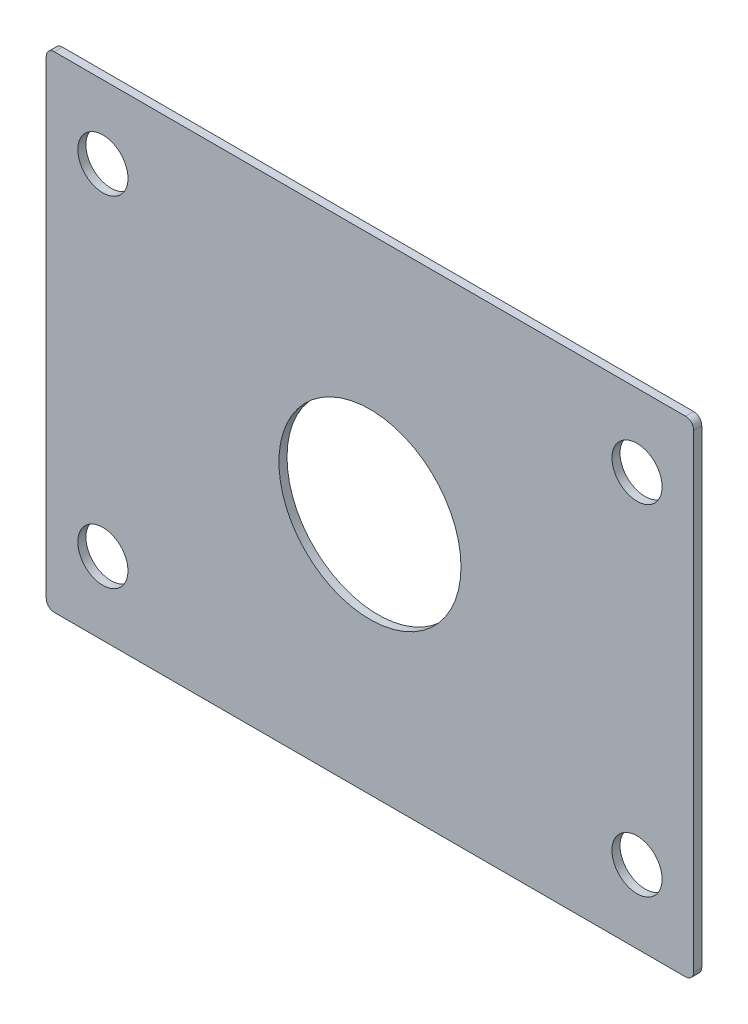
ISO-10303-21;
HEADER;
FILE_DESCRIPTION(('STEP AP214'),'2;1');
FILE_NAME('part.step','',(''),(''),'','','');
FILE_SCHEMA(('AUTOMOTIVE_DESIGN { 1 0 10303 214 1 1 1 1 }'));
ENDSEC;
DATA;
#1=APPLICATION_CONTEXT('core data for automotive mechanical design processes');
#2=APPLICATION_PROTOCOL_DEFINITION('international standard','automotive_design',2000,#1);
#3=PRODUCT_CONTEXT('',#1,'mechanical');
#4=PRODUCT('Part','Part','',(#3));
#5=PRODUCT_RELATED_PRODUCT_CATEGORY('part','',(#4));
#6=PRODUCT_DEFINITION_FORMATION('','',#4);
#7=PRODUCT_DEFINITION_CONTEXT('part definition',#1,'design');
#8=PRODUCT_DEFINITION('design','',#6,#7);
#9=PRODUCT_DEFINITION_SHAPE('','',#8);
#10=(LENGTH_UNIT() NAMED_UNIT(*) SI_UNIT(.MILLI.,.METRE.));
#11=(NAMED_UNIT(*) PLANE_ANGLE_UNIT() SI_UNIT($,.RADIAN.));
#12=(NAMED_UNIT(*) SI_UNIT($,.STERADIAN.) SOLID_ANGLE_UNIT());
#13=UNCERTAINTY_MEASURE_WITH_UNIT(LENGTH_MEASURE(1.E-05),#10,'distance_accuracy_value','');
#14=(GEOMETRIC_REPRESENTATION_CONTEXT(3) GLOBAL_UNCERTAINTY_ASSIGNED_CONTEXT((#13)) GLOBAL_UNIT_ASSIGNED_CONTEXT((#10,
#11,#12)) REPRESENTATION_CONTEXT('',''));
#15=CARTESIAN_POINT('',(0.,0.,0.));
#16=DIRECTION('',(0.,0.,1.));
#17=DIRECTION('',(1.,0.,0.));
#18=AXIS2_PLACEMENT_3D('',#15,#16,#17);
#19=CARTESIAN_POINT('',(-40.,30.,1.));
#20=DIRECTION('',(1.,0.,0.));
#21=DIRECTION('',(0.,1.,0.));
#22=AXIS2_PLACEMENT_3D('',#19,#20,#21);
#23=PLANE('',#22);
#24=DIRECTION('',(0.,-1.,0.));
#25=VECTOR('',#24,1.);
#26=CARTESIAN_POINT('',(-40.,30.,0.));
#27=LINE('',#26,#25);
#28=CARTESIAN_POINT('',(-40.,29.,0.));
#29=VERTEX_POINT('',#28);
#30=CARTESIAN_POINT('',(-40.,-29.,0.));
#31=VERTEX_POINT('',#30);
#32=EDGE_CURVE('E133',#29,#31,#27,.T.);
#33=ORIENTED_EDGE('',*,*,#32,.T.);
#34=DIRECTION('',(0.,0.,-1.));
#35=VECTOR('',#34,1.);
#36=CARTESIAN_POINT('',(-40.,-29.,1.));
#37=LINE('',#36,#35);
#38=CARTESIAN_POINT('',(-40.,-29.,1.));
#39=VERTEX_POINT('',#38);
#40=EDGE_CURVE('E111',#31,#39,#37,.F.);
#41=ORIENTED_EDGE('',*,*,#40,.T.);
#42=DIRECTION('',(0.,-1.,0.));
#43=VECTOR('',#42,1.);
#44=CARTESIAN_POINT('',(-40.,30.,1.));
#45=LINE('',#44,#43);
#46=CARTESIAN_POINT('',(-40.,29.,1.));
#47=VERTEX_POINT('',#46);
#48=EDGE_CURVE('E142',#47,#39,#45,.T.);
#49=ORIENTED_EDGE('',*,*,#48,.F.);
#50=DIRECTION('',(0.,0.,-1.));
#51=VECTOR('',#50,1.);
#52=CARTESIAN_POINT('',(-40.,29.,1.));
#53=LINE('',#52,#51);
#54=EDGE_CURVE('E116',#47,#29,#53,.T.);
#55=ORIENTED_EDGE('',*,*,#54,.T.);
#56=EDGE_LOOP('',(#33,#41,#49,#55));
#57=FACE_BOUND('',#56,.T.);
#58=ADVANCED_FACE('F40',(#57),#23,.F.);
#59=CARTESIAN_POINT('',(40.,-30.,1.));
#60=DIRECTION('',(0.,1.,0.));
#61=DIRECTION('',(0.,0.,1.));
#62=AXIS2_PLACEMENT_3D('',#59,#60,#61);
#63=PLANE('',#62);
#64=DIRECTION('',(1.,0.,0.));
#65=VECTOR('',#64,1.);
#66=CARTESIAN_POINT('',(40.,-30.,1.));
#67=LINE('',#66,#65);
#68=CARTESIAN_POINT('',(-39.,-30.,1.));
#69=VERTEX_POINT('',#68);
#70=CARTESIAN_POINT('',(39.,-30.,1.));
#71=VERTEX_POINT('',#70);
#72=EDGE_CURVE('E126',#69,#71,#67,.T.);
#73=ORIENTED_EDGE('',*,*,#72,.F.);
#74=DIRECTION('',(0.,0.,-1.));
#75=VECTOR('',#74,1.);
#76=CARTESIAN_POINT('',(-39.,-30.,1.));
#77=LINE('',#76,#75);
#78=CARTESIAN_POINT('',(-39.,-30.,0.));
#79=VERTEX_POINT('',#78);
#80=EDGE_CURVE('E110',#69,#79,#77,.T.);
#81=ORIENTED_EDGE('',*,*,#80,.T.);
#82=DIRECTION('',(1.,0.,0.));
#83=VECTOR('',#82,1.);
#84=CARTESIAN_POINT('',(40.,-30.,0.));
#85=LINE('',#84,#83);
#86=CARTESIAN_POINT('',(39.,-30.,0.));
#87=VERTEX_POINT('',#86);
#88=EDGE_CURVE('E123',#79,#87,#85,.T.);
#89=ORIENTED_EDGE('',*,*,#88,.T.);
#90=DIRECTION('',(0.,0.,-1.));
#91=VECTOR('',#90,1.);
#92=CARTESIAN_POINT('',(39.,-30.,1.));
#93=LINE('',#92,#91);
#94=EDGE_CURVE('E128',#87,#71,#93,.F.);
#95=ORIENTED_EDGE('',*,*,#94,.T.);
#96=EDGE_LOOP('',(#73,#81,#89,#95));
#97=FACE_BOUND('',#96,.T.);
#98=ADVANCED_FACE('F122',(#97),#63,.F.);
#99=CARTESIAN_POINT('',(40.,30.,1.));
#100=DIRECTION('',(-1.,0.,0.));
#101=DIRECTION('',(0.,0.,1.));
#102=AXIS2_PLACEMENT_3D('',#99,#100,#101);
#103=PLANE('',#102);
#104=DIRECTION('',(0.,1.,0.));
#105=VECTOR('',#104,1.);
#106=CARTESIAN_POINT('',(40.,30.,1.));
#107=LINE('',#106,#105);
#108=CARTESIAN_POINT('',(40.,-29.,1.));
#109=VERTEX_POINT('',#108);
#110=CARTESIAN_POINT('',(40.,29.,1.));
#111=VERTEX_POINT('',#110);
#112=EDGE_CURVE('E187',#109,#111,#107,.T.);
#113=ORIENTED_EDGE('',*,*,#112,.F.);
#114=DIRECTION('',(0.,0.,-1.));
#115=VECTOR('',#114,1.);
#116=CARTESIAN_POINT('',(40.,-29.,1.));
#117=LINE('',#116,#115);
#118=CARTESIAN_POINT('',(40.,-29.,0.));
#119=VERTEX_POINT('',#118);
#120=EDGE_CURVE('E180',#109,#119,#117,.T.);
#121=ORIENTED_EDGE('',*,*,#120,.T.);
#122=DIRECTION('',(0.,1.,0.));
#123=VECTOR('',#122,1.);
#124=CARTESIAN_POINT('',(40.,30.,0.));
#125=LINE('',#124,#123);
#126=CARTESIAN_POINT('',(40.,29.,0.));
#127=VERTEX_POINT('',#126);
#128=EDGE_CURVE('E132',#119,#127,#125,.T.);
#129=ORIENTED_EDGE('',*,*,#128,.T.);
#130=DIRECTION('',(0.,0.,-1.));
#131=VECTOR('',#130,1.);
#132=CARTESIAN_POINT('',(40.,29.,1.));
#133=LINE('',#132,#131);
#134=EDGE_CURVE('E178',#127,#111,#133,.F.);
#135=ORIENTED_EDGE('',*,*,#134,.T.);
#136=EDGE_LOOP('',(#113,#121,#129,#135));
#137=FACE_BOUND('',#136,.T.);
#138=ADVANCED_FACE('F185',(#137),#103,.F.);
#139=CARTESIAN_POINT('',(40.,30.,1.));
#140=DIRECTION('',(0.,-1.,0.));
#141=DIRECTION('',(1.,0.,0.));
#142=AXIS2_PLACEMENT_3D('',#139,#140,#141);
#143=PLANE('',#142);
#144=DIRECTION('',(-1.,0.,0.));
#145=VECTOR('',#144,1.);
#146=CARTESIAN_POINT('',(40.,30.,1.));
#147=LINE('',#146,#145);
#148=CARTESIAN_POINT('',(39.,30.,1.));
#149=VERTEX_POINT('',#148);
#150=CARTESIAN_POINT('',(-39.,30.,1.));
#151=VERTEX_POINT('',#150);
#152=EDGE_CURVE('E158',#149,#151,#147,.T.);
#153=ORIENTED_EDGE('',*,*,#152,.F.);
#154=DIRECTION('',(0.,0.,-1.));
#155=VECTOR('',#154,1.);
#156=CARTESIAN_POINT('',(39.,30.,1.));
#157=LINE('',#156,#155);
#158=CARTESIAN_POINT('',(39.,30.,0.));
#159=VERTEX_POINT('',#158);
#160=EDGE_CURVE('E12',#149,#159,#157,.T.);
#161=ORIENTED_EDGE('',*,*,#160,.T.);
#162=DIRECTION('',(-1.,0.,0.));
#163=VECTOR('',#162,1.);
#164=CARTESIAN_POINT('',(40.,30.,0.));
#165=LINE('',#164,#163);
#166=CARTESIAN_POINT('',(-39.,30.,0.));
#167=VERTEX_POINT('',#166);
#168=EDGE_CURVE('E136',#159,#167,#165,.T.);
#169=ORIENTED_EDGE('',*,*,#168,.T.);
#170=DIRECTION('',(0.,0.,-1.));
#171=VECTOR('',#170,1.);
#172=CARTESIAN_POINT('',(-39.,30.,1.));
#173=LINE('',#172,#171);
#174=EDGE_CURVE('E48',#167,#151,#173,.F.);
#175=ORIENTED_EDGE('',*,*,#174,.T.);
#176=EDGE_LOOP('',(#153,#161,#169,#175));
#177=FACE_BOUND('',#176,.T.);
#178=ADVANCED_FACE('F194',(#177),#143,.F.);
#179=CARTESIAN_POINT('',(0.,0.,1.));
#180=DIRECTION('',(0.,0.,-1.));
#181=DIRECTION('',(-1.,0.,0.));
#182=AXIS2_PLACEMENT_3D('',#179,#180,#181);
#183=PLANE('',#182);
#184=CARTESIAN_POINT('',(0.,0.,1.));
#185=DIRECTION('',(0.,0.,1.));
#186=DIRECTION('',(1.,0.,0.));
#187=AXIS2_PLACEMENT_3D('',#184,#185,#186);
#188=CIRCLE('',#187,11.25);
#189=CARTESIAN_POINT('',(11.25,0.,1.));
#190=VERTEX_POINT('',#189);
#191=EDGE_CURVE('E217',#190,#190,#188,.T.);
#192=ORIENTED_EDGE('',*,*,#191,.F.);
#193=EDGE_LOOP('',(#192));
#194=FACE_BOUND('',#193,.T.);
#195=CARTESIAN_POINT('',(-33.,-21.0000000000002,1.));
#196=DIRECTION('',(0.,0.,1.));
#197=DIRECTION('',(-1.,0.,0.));
#198=AXIS2_PLACEMENT_3D('',#195,#196,#197);
#199=CIRCLE('',#198,3.09999999999999);
#200=CARTESIAN_POINT('',(-36.1,-21.0000000000002,1.));
#201=VERTEX_POINT('',#200);
#202=EDGE_CURVE('E222',#201,#201,#199,.T.);
#203=ORIENTED_EDGE('',*,*,#202,.F.);
#204=EDGE_LOOP('',(#203));
#205=FACE_BOUND('',#204,.T.);
#206=CARTESIAN_POINT('',(33.,-21.0000000000002,1.));
#207=DIRECTION('',(0.,0.,1.));
#208=DIRECTION('',(1.,0.,0.));
#209=AXIS2_PLACEMENT_3D('',#206,#207,#208);
#210=CIRCLE('',#209,3.09999999999993);
#211=CARTESIAN_POINT('',(36.1,-21.0000000000002,1.));
#212=VERTEX_POINT('',#211);
#213=EDGE_CURVE('E229',#212,#212,#210,.T.);
#214=ORIENTED_EDGE('',*,*,#213,.F.);
#215=EDGE_LOOP('',(#214));
#216=FACE_BOUND('',#215,.T.);
#217=CARTESIAN_POINT('',(33.,21.0000000000002,1.));
#218=DIRECTION('',(0.,0.,1.));
#219=DIRECTION('',(-1.,0.,0.));
#220=AXIS2_PLACEMENT_3D('',#217,#218,#219);
#221=CIRCLE('',#220,3.09999999999993);
#222=CARTESIAN_POINT('',(29.9000000000001,21.0000000000002,1.));
#223=VERTEX_POINT('',#222);
#224=EDGE_CURVE('E216',#223,#223,#221,.T.);
#225=ORIENTED_EDGE('',*,*,#224,.F.);
#226=EDGE_LOOP('',(#225));
#227=FACE_BOUND('',#226,.T.);
#228=CARTESIAN_POINT('',(-33.,21.0000000000002,1.));
#229=DIRECTION('',(0.,0.,1.));
#230=DIRECTION('',(1.,0.,0.));
#231=AXIS2_PLACEMENT_3D('',#228,#229,#230);
#232=CIRCLE('',#231,3.09999999999999);
#233=CARTESIAN_POINT('',(-29.9,21.0000000000002,1.));
#234=VERTEX_POINT('',#233);
#235=EDGE_CURVE('E147',#234,#234,#232,.T.);
#236=ORIENTED_EDGE('',*,*,#235,.F.);
#237=EDGE_LOOP('',(#236));
#238=FACE_BOUND('',#237,.T.);
#239=ORIENTED_EDGE('',*,*,#48,.T.);
#240=CARTESIAN_POINT('',(-39.,-29.,1.));
#241=DIRECTION('',(0.,0.,-1.));
#242=DIRECTION('',(-1.,0.,0.));
#243=AXIS2_PLACEMENT_3D('',#240,#241,#242);
#244=CIRCLE('',#243,1.);
#245=EDGE_CURVE('E175',#39,#69,#244,.F.);
#246=ORIENTED_EDGE('',*,*,#245,.T.);
#247=ORIENTED_EDGE('',*,*,#72,.T.);
#248=CARTESIAN_POINT('',(39.,-29.,1.));
#249=DIRECTION('',(0.,0.,-1.));
#250=DIRECTION('',(-1.,0.,0.));
#251=AXIS2_PLACEMENT_3D('',#248,#249,#250);
#252=CIRCLE('',#251,1.);
#253=EDGE_CURVE('E172',#71,#109,#252,.F.);
#254=ORIENTED_EDGE('',*,*,#253,.T.);
#255=ORIENTED_EDGE('',*,*,#112,.T.);
#256=CARTESIAN_POINT('',(39.,29.,1.));
#257=DIRECTION('',(0.,0.,-1.));
#258=DIRECTION('',(-1.,0.,0.));
#259=AXIS2_PLACEMENT_3D('',#256,#257,#258);
#260=CIRCLE('',#259,1.);
#261=EDGE_CURVE('E61',#111,#149,#260,.F.);
#262=ORIENTED_EDGE('',*,*,#261,.T.);
#263=ORIENTED_EDGE('',*,*,#152,.T.);
#264=CARTESIAN_POINT('',(-39.,29.,1.));
#265=DIRECTION('',(0.,0.,-1.));
#266=DIRECTION('',(-1.,0.,0.));
#267=AXIS2_PLACEMENT_3D('',#264,#265,#266);
#268=CIRCLE('',#267,1.);
#269=EDGE_CURVE('E167',#151,#47,#268,.F.);
#270=ORIENTED_EDGE('',*,*,#269,.T.);
#271=EDGE_LOOP('',(#239,#246,#247,#254,#255,#262,#263,#270));
#272=FACE_BOUND('',#271,.T.);
#273=ADVANCED_FACE('F240',(#194,#205,#216,#227,#238,#272),#183,.F.);
#274=CARTESIAN_POINT('',(0.,0.,0.));
#275=DIRECTION('',(0.,0.,-1.));
#276=DIRECTION('',(-1.,0.,0.));
#277=AXIS2_PLACEMENT_3D('',#274,#275,#276);
#278=PLANE('',#277);
#279=CARTESIAN_POINT('',(0.,0.,0.));
#280=DIRECTION('',(0.,0.,-1.));
#281=DIRECTION('',(-1.,0.,0.));
#282=AXIS2_PLACEMENT_3D('',#279,#280,#281);
#283=CIRCLE('',#282,11.25);
#284=CARTESIAN_POINT('',(-11.25,0.,0.));
#285=VERTEX_POINT('',#284);
#286=EDGE_CURVE('E138',#285,#285,#283,.T.);
#287=ORIENTED_EDGE('',*,*,#286,.F.);
#288=EDGE_LOOP('',(#287));
#289=FACE_BOUND('',#288,.T.);
#290=CARTESIAN_POINT('',(-33.,-21.0000000000002,0.));
#291=DIRECTION('',(0.,0.,-1.));
#292=DIRECTION('',(-1.,0.,0.));
#293=AXIS2_PLACEMENT_3D('',#290,#291,#292);
#294=CIRCLE('',#293,3.09999999999999);
#295=CARTESIAN_POINT('',(-36.1,-21.0000000000002,0.));
#296=VERTEX_POINT('',#295);
#297=EDGE_CURVE('E153',#296,#296,#294,.T.);
#298=ORIENTED_EDGE('',*,*,#297,.F.);
#299=EDGE_LOOP('',(#298));
#300=FACE_BOUND('',#299,.T.);
#301=CARTESIAN_POINT('',(33.,-21.0000000000002,0.));
#302=DIRECTION('',(0.,0.,-1.));
#303=DIRECTION('',(-1.,0.,0.));
#304=AXIS2_PLACEMENT_3D('',#301,#302,#303);
#305=CIRCLE('',#304,3.09999999999993);
#306=CARTESIAN_POINT('',(29.9000000000001,-21.0000000000002,0.));
#307=VERTEX_POINT('',#306);
#308=EDGE_CURVE('E150',#307,#307,#305,.T.);
#309=ORIENTED_EDGE('',*,*,#308,.F.);
#310=EDGE_LOOP('',(#309));
#311=FACE_BOUND('',#310,.T.);
#312=CARTESIAN_POINT('',(33.,21.0000000000002,0.));
#313=DIRECTION('',(0.,0.,-1.));
#314=DIRECTION('',(-1.,0.,0.));
#315=AXIS2_PLACEMENT_3D('',#312,#313,#314);
#316=CIRCLE('',#315,3.09999999999993);
#317=CARTESIAN_POINT('',(29.9000000000001,21.0000000000002,0.));
#318=VERTEX_POINT('',#317);
#319=EDGE_CURVE('E146',#318,#318,#316,.T.);
#320=ORIENTED_EDGE('',*,*,#319,.F.);
#321=EDGE_LOOP('',(#320));
#322=FACE_BOUND('',#321,.T.);
#323=CARTESIAN_POINT('',(-33.,21.0000000000002,0.));
#324=DIRECTION('',(0.,0.,-1.));
#325=DIRECTION('',(-1.,0.,0.));
#326=AXIS2_PLACEMENT_3D('',#323,#324,#325);
#327=CIRCLE('',#326,3.09999999999999);
#328=CARTESIAN_POINT('',(-36.1,21.0000000000002,0.));
#329=VERTEX_POINT('',#328);
#330=EDGE_CURVE('E143',#329,#329,#327,.T.);
#331=ORIENTED_EDGE('',*,*,#330,.F.);
#332=EDGE_LOOP('',(#331));
#333=FACE_BOUND('',#332,.T.);
#334=ORIENTED_EDGE('',*,*,#88,.F.);
#335=CARTESIAN_POINT('',(-39.,-29.,0.));
#336=DIRECTION('',(0.,0.,-1.));
#337=DIRECTION('',(-1.,0.,0.));
#338=AXIS2_PLACEMENT_3D('',#335,#336,#337);
#339=CIRCLE('',#338,1.);
#340=EDGE_CURVE('E106',#79,#31,#339,.T.);
#341=ORIENTED_EDGE('',*,*,#340,.T.);
#342=ORIENTED_EDGE('',*,*,#32,.F.);
#343=CARTESIAN_POINT('',(-39.,29.,0.));
#344=DIRECTION('',(0.,0.,-1.));
#345=DIRECTION('',(-1.,0.,0.));
#346=AXIS2_PLACEMENT_3D('',#343,#344,#345);
#347=CIRCLE('',#346,1.);
#348=EDGE_CURVE('E127',#29,#167,#347,.T.);
#349=ORIENTED_EDGE('',*,*,#348,.T.);
#350=ORIENTED_EDGE('',*,*,#168,.F.);
#351=CARTESIAN_POINT('',(39.,29.,0.));
#352=DIRECTION('',(0.,0.,-1.));
#353=DIRECTION('',(-1.,0.,0.));
#354=AXIS2_PLACEMENT_3D('',#351,#352,#353);
#355=CIRCLE('',#354,1.);
#356=EDGE_CURVE('E161',#159,#127,#355,.T.);
#357=ORIENTED_EDGE('',*,*,#356,.T.);
#358=ORIENTED_EDGE('',*,*,#128,.F.);
#359=CARTESIAN_POINT('',(39.,-29.,0.));
#360=DIRECTION('',(0.,0.,-1.));
#361=DIRECTION('',(-1.,0.,0.));
#362=AXIS2_PLACEMENT_3D('',#359,#360,#361);
#363=CIRCLE('',#362,1.);
#364=EDGE_CURVE('E117',#119,#87,#363,.T.);
#365=ORIENTED_EDGE('',*,*,#364,.T.);
#366=EDGE_LOOP('',(#334,#341,#342,#349,#350,#357,#358,#365));
#367=FACE_BOUND('',#366,.T.);
#368=ADVANCED_FACE('F130',(#289,#300,#311,#322,#333,#367),#278,.T.);
#369=CARTESIAN_POINT('',(-33.,21.0000000000002,-9.));
#370=DIRECTION('',(0.,0.,1.));
#371=DIRECTION('',(1.,0.,0.));
#372=AXIS2_PLACEMENT_3D('',#369,#370,#371);
#373=CYLINDRICAL_SURFACE('',#372,3.09999999999999);
#374=ORIENTED_EDGE('',*,*,#330,.T.);
#375=EDGE_LOOP('',(#374));
#376=FACE_BOUND('',#375,.T.);
#377=ORIENTED_EDGE('',*,*,#235,.T.);
#378=EDGE_LOOP('',(#377));
#379=FACE_BOUND('',#378,.T.);
#380=ADVANCED_FACE('F323',(#376,#379),#373,.F.);
#381=CARTESIAN_POINT('',(33.,21.0000000000002,-9.));
#382=DIRECTION('',(0.,0.,1.));
#383=DIRECTION('',(1.,0.,0.));
#384=AXIS2_PLACEMENT_3D('',#381,#382,#383);
#385=CYLINDRICAL_SURFACE('',#384,3.09999999999993);
#386=ORIENTED_EDGE('',*,*,#319,.T.);
#387=EDGE_LOOP('',(#386));
#388=FACE_BOUND('',#387,.T.);
#389=ORIENTED_EDGE('',*,*,#224,.T.);
#390=EDGE_LOOP('',(#389));
#391=FACE_BOUND('',#390,.T.);
#392=ADVANCED_FACE('F238',(#388,#391),#385,.F.);
#393=CARTESIAN_POINT('',(33.,-21.0000000000002,-9.));
#394=DIRECTION('',(0.,0.,1.));
#395=DIRECTION('',(1.,0.,0.));
#396=AXIS2_PLACEMENT_3D('',#393,#394,#395);
#397=CYLINDRICAL_SURFACE('',#396,3.09999999999993);
#398=ORIENTED_EDGE('',*,*,#308,.T.);
#399=EDGE_LOOP('',(#398));
#400=FACE_BOUND('',#399,.T.);
#401=ORIENTED_EDGE('',*,*,#213,.T.);
#402=EDGE_LOOP('',(#401));
#403=FACE_BOUND('',#402,.T.);
#404=ADVANCED_FACE('F306',(#400,#403),#397,.F.);
#405=CARTESIAN_POINT('',(-33.,-21.0000000000002,-9.));
#406=DIRECTION('',(0.,0.,1.));
#407=DIRECTION('',(1.,0.,0.));
#408=AXIS2_PLACEMENT_3D('',#405,#406,#407);
#409=CYLINDRICAL_SURFACE('',#408,3.09999999999999);
#410=ORIENTED_EDGE('',*,*,#297,.T.);
#411=EDGE_LOOP('',(#410));
#412=FACE_BOUND('',#411,.T.);
#413=ORIENTED_EDGE('',*,*,#202,.T.);
#414=EDGE_LOOP('',(#413));
#415=FACE_BOUND('',#414,.T.);
#416=ADVANCED_FACE('F297',(#412,#415),#409,.F.);
#417=CARTESIAN_POINT('',(0.,0.,-9.));
#418=DIRECTION('',(0.,0.,1.));
#419=DIRECTION('',(1.,0.,0.));
#420=AXIS2_PLACEMENT_3D('',#417,#418,#419);
#421=CYLINDRICAL_SURFACE('',#420,11.25);
#422=ORIENTED_EDGE('',*,*,#286,.T.);
#423=EDGE_LOOP('',(#422));
#424=FACE_BOUND('',#423,.T.);
#425=ORIENTED_EDGE('',*,*,#191,.T.);
#426=EDGE_LOOP('',(#425));
#427=FACE_BOUND('',#426,.T.);
#428=ADVANCED_FACE('F265',(#424,#427),#421,.F.);
#429=CARTESIAN_POINT('',(-39.,-29.,1.));
#430=DIRECTION('',(0.,0.,-1.));
#431=DIRECTION('',(-1.,0.,0.));
#432=AXIS2_PLACEMENT_3D('',#429,#430,#431);
#433=CYLINDRICAL_SURFACE('',#432,1.);
#434=ORIENTED_EDGE('',*,*,#245,.F.);
#435=ORIENTED_EDGE('',*,*,#40,.F.);
#436=ORIENTED_EDGE('',*,*,#340,.F.);
#437=ORIENTED_EDGE('',*,*,#80,.F.);
#438=EDGE_LOOP('',(#434,#435,#436,#437));
#439=FACE_BOUND('',#438,.T.);
#440=ADVANCED_FACE('F109',(#439),#433,.T.);
#441=CARTESIAN_POINT('',(39.,-29.,1.));
#442=DIRECTION('',(0.,0.,-1.));
#443=DIRECTION('',(-1.,0.,0.));
#444=AXIS2_PLACEMENT_3D('',#441,#442,#443);
#445=CYLINDRICAL_SURFACE('',#444,1.);
#446=ORIENTED_EDGE('',*,*,#253,.F.);
#447=ORIENTED_EDGE('',*,*,#94,.F.);
#448=ORIENTED_EDGE('',*,*,#364,.F.);
#449=ORIENTED_EDGE('',*,*,#120,.F.);
#450=EDGE_LOOP('',(#446,#447,#448,#449));
#451=FACE_BOUND('',#450,.T.);
#452=ADVANCED_FACE('F254',(#451),#445,.T.);
#453=CARTESIAN_POINT('',(39.,29.,1.));
#454=DIRECTION('',(0.,0.,-1.));
#455=DIRECTION('',(-1.,0.,0.));
#456=AXIS2_PLACEMENT_3D('',#453,#454,#455);
#457=CYLINDRICAL_SURFACE('',#456,1.);
#458=ORIENTED_EDGE('',*,*,#261,.F.);
#459=ORIENTED_EDGE('',*,*,#134,.F.);
#460=ORIENTED_EDGE('',*,*,#356,.F.);
#461=ORIENTED_EDGE('',*,*,#160,.F.);
#462=EDGE_LOOP('',(#458,#459,#460,#461));
#463=FACE_BOUND('',#462,.T.);
#464=ADVANCED_FACE('F193',(#463),#457,.T.);
#465=CARTESIAN_POINT('',(-39.,29.,1.));
#466=DIRECTION('',(0.,0.,-1.));
#467=DIRECTION('',(-1.,0.,0.));
#468=AXIS2_PLACEMENT_3D('',#465,#466,#467);
#469=CYLINDRICAL_SURFACE('',#468,1.);
#470=ORIENTED_EDGE('',*,*,#269,.F.);
#471=ORIENTED_EDGE('',*,*,#174,.F.);
#472=ORIENTED_EDGE('',*,*,#348,.F.);
#473=ORIENTED_EDGE('',*,*,#54,.F.);
#474=EDGE_LOOP('',(#470,#471,#472,#473));
#475=FACE_BOUND('',#474,.T.);
#476=ADVANCED_FACE('F42',(#475),#469,.T.);
#477=CLOSED_SHELL('',(#58,#98,#138,#178,#273,#368,#380,#392,#404,#416,#428,#440,#452,#464,#476));
#478=MANIFOLD_SOLID_BREP('B2',#477);
#479=ADVANCED_BREP_SHAPE_REPRESENTATION('',(#18,#478),#14);
#480=SHAPE_DEFINITION_REPRESENTATION(#9,#479);
ENDSEC;
END-ISO-10303-21;
